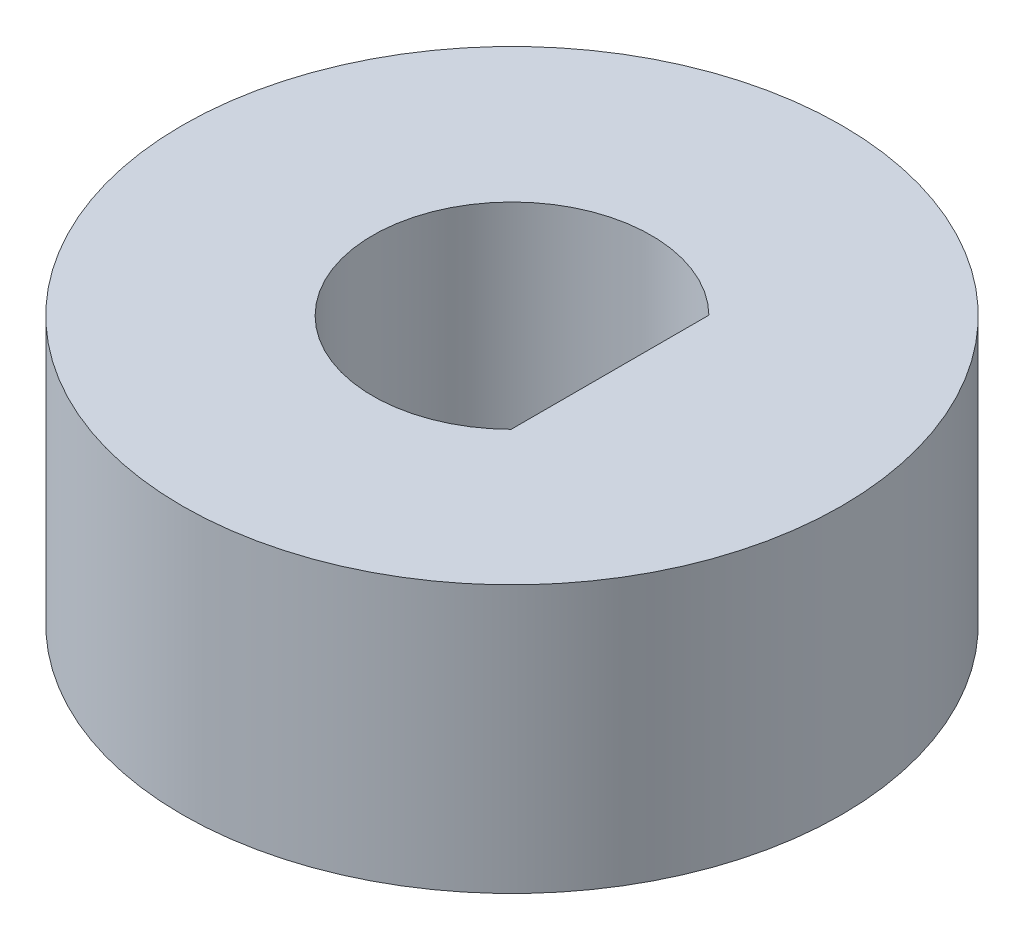
ISO-10303-21;
HEADER;
FILE_DESCRIPTION(('STEP AP214'),'2;1');
FILE_NAME('part.step','',(''),(''),'','','');
FILE_SCHEMA(('AUTOMOTIVE_DESIGN { 1 0 10303 214 1 1 1 1 }'));
ENDSEC;
DATA;
#1=APPLICATION_CONTEXT('core data for automotive mechanical design processes');
#2=APPLICATION_PROTOCOL_DEFINITION('international standard','automotive_design',2000,#1);
#3=PRODUCT_CONTEXT('',#1,'mechanical');
#4=PRODUCT('Part','Part','',(#3));
#5=PRODUCT_RELATED_PRODUCT_CATEGORY('part','',(#4));
#6=PRODUCT_DEFINITION_FORMATION('','',#4);
#7=PRODUCT_DEFINITION_CONTEXT('part definition',#1,'design');
#8=PRODUCT_DEFINITION('design','',#6,#7);
#9=PRODUCT_DEFINITION_SHAPE('','',#8);
#10=(LENGTH_UNIT() NAMED_UNIT(*) SI_UNIT(.MILLI.,.METRE.));
#11=(NAMED_UNIT(*) PLANE_ANGLE_UNIT() SI_UNIT($,.RADIAN.));
#12=(NAMED_UNIT(*) SI_UNIT($,.STERADIAN.) SOLID_ANGLE_UNIT());
#13=UNCERTAINTY_MEASURE_WITH_UNIT(LENGTH_MEASURE(1.E-05),#10,'distance_accuracy_value','');
#14=(GEOMETRIC_REPRESENTATION_CONTEXT(3) GLOBAL_UNCERTAINTY_ASSIGNED_CONTEXT((#13)) GLOBAL_UNIT_ASSIGNED_CONTEXT((#10,
#11,#12)) REPRESENTATION_CONTEXT('',''));
#15=CARTESIAN_POINT('',(0.,0.,0.));
#16=DIRECTION('',(0.,0.,1.));
#17=DIRECTION('',(1.,0.,0.));
#18=AXIS2_PLACEMENT_3D('',#15,#16,#17);
#19=CARTESIAN_POINT('',(0.,6.,0.));
#20=DIRECTION('',(0.,1.,0.));
#21=DIRECTION('',(0.,0.,1.));
#22=AXIS2_PLACEMENT_3D('',#19,#20,#21);
#23=PLANE('',#22);
#24=CARTESIAN_POINT('',(0.,6.,0.));
#25=DIRECTION('',(0.,1.,0.));
#26=DIRECTION('',(0.,0.,1.));
#27=AXIS2_PLACEMENT_3D('',#24,#25,#26);
#28=CIRCLE('',#27,7.4);
#29=CARTESIAN_POINT('',(0.,6.,7.4));
#30=VERTEX_POINT('',#29);
#31=EDGE_CURVE('E11',#30,#30,#28,.T.);
#32=ORIENTED_EDGE('',*,*,#31,.T.);
#33=EDGE_LOOP('',(#32));
#34=FACE_BOUND('',#33,.T.);
#35=DIRECTION('',(0.,0.,-1.));
#36=VECTOR('',#35,1.);
#37=CARTESIAN_POINT('',(2.2,6.,-2.21937491199662));
#38=LINE('',#37,#36);
#39=CARTESIAN_POINT('',(2.2,6.,2.21937491199662));
#40=VERTEX_POINT('',#39);
#41=CARTESIAN_POINT('',(2.2,6.,-2.21937491199662));
#42=VERTEX_POINT('',#41);
#43=EDGE_CURVE('E82',#40,#42,#38,.T.);
#44=ORIENTED_EDGE('',*,*,#43,.F.);
#45=CARTESIAN_POINT('',(0.,6.,0.));
#46=DIRECTION('',(0.,1.,0.));
#47=DIRECTION('',(0.,0.,1.));
#48=AXIS2_PLACEMENT_3D('',#45,#46,#47);
#49=CIRCLE('',#48,3.125);
#50=EDGE_CURVE('E73',#42,#40,#49,.T.);
#51=ORIENTED_EDGE('',*,*,#50,.F.);
#52=EDGE_LOOP('',(#44,#51));
#53=FACE_BOUND('',#52,.T.);
#54=ADVANCED_FACE('F41',(#34,#53),#23,.T.);
#55=CARTESIAN_POINT('',(0.,0.,0.));
#56=DIRECTION('',(0.,1.,0.));
#57=DIRECTION('',(0.,0.,1.));
#58=AXIS2_PLACEMENT_3D('',#55,#56,#57);
#59=PLANE('',#58);
#60=CARTESIAN_POINT('',(0.,0.,0.));
#61=DIRECTION('',(0.,1.,0.));
#62=DIRECTION('',(0.,0.,1.));
#63=AXIS2_PLACEMENT_3D('',#60,#61,#62);
#64=CIRCLE('',#63,7.4);
#65=CARTESIAN_POINT('',(0.,0.,7.4));
#66=VERTEX_POINT('',#65);
#67=EDGE_CURVE('E45',#66,#66,#64,.T.);
#68=ORIENTED_EDGE('',*,*,#67,.F.);
#69=EDGE_LOOP('',(#68));
#70=FACE_BOUND('',#69,.T.);
#71=CARTESIAN_POINT('',(0.,0.,0.));
#72=DIRECTION('',(0.,1.,0.));
#73=DIRECTION('',(0.,0.,1.));
#74=AXIS2_PLACEMENT_3D('',#71,#72,#73);
#75=CIRCLE('',#74,3.125);
#76=CARTESIAN_POINT('',(2.2,0.,-2.21937491199662));
#77=VERTEX_POINT('',#76);
#78=CARTESIAN_POINT('',(2.2,0.,2.21937491199662));
#79=VERTEX_POINT('',#78);
#80=EDGE_CURVE('E63',#77,#79,#75,.T.);
#81=ORIENTED_EDGE('',*,*,#80,.T.);
#82=DIRECTION('',(0.,0.,-1.));
#83=VECTOR('',#82,1.);
#84=CARTESIAN_POINT('',(2.2,0.,-2.21937491199662));
#85=LINE('',#84,#83);
#86=EDGE_CURVE('E69',#79,#77,#85,.T.);
#87=ORIENTED_EDGE('',*,*,#86,.T.);
#88=EDGE_LOOP('',(#81,#87));
#89=FACE_BOUND('',#88,.T.);
#90=ADVANCED_FACE('F79',(#70,#89),#59,.F.);
#91=CARTESIAN_POINT('',(0.,6.,0.));
#92=DIRECTION('',(0.,-1.,0.));
#93=DIRECTION('',(0.,0.,-1.));
#94=AXIS2_PLACEMENT_3D('',#91,#92,#93);
#95=CYLINDRICAL_SURFACE('',#94,7.4);
#96=ORIENTED_EDGE('',*,*,#31,.F.);
#97=EDGE_LOOP('',(#96));
#98=FACE_BOUND('',#97,.T.);
#99=ORIENTED_EDGE('',*,*,#67,.T.);
#100=EDGE_LOOP('',(#99));
#101=FACE_BOUND('',#100,.T.);
#102=ADVANCED_FACE('F43',(#98,#101),#95,.T.);
#103=CARTESIAN_POINT('',(0.,6.,0.));
#104=DIRECTION('',(0.,-1.,0.));
#105=DIRECTION('',(0.,0.,-1.));
#106=AXIS2_PLACEMENT_3D('',#103,#104,#105);
#107=CYLINDRICAL_SURFACE('',#106,3.125);
#108=ORIENTED_EDGE('',*,*,#80,.F.);
#109=DIRECTION('',(0.,-1.,0.));
#110=VECTOR('',#109,1.);
#111=CARTESIAN_POINT('',(2.2,6.,-2.21937491199662));
#112=LINE('',#111,#110);
#113=EDGE_CURVE('E71',#42,#77,#112,.T.);
#114=ORIENTED_EDGE('',*,*,#113,.F.);
#115=ORIENTED_EDGE('',*,*,#50,.T.);
#116=DIRECTION('',(0.,-1.,0.));
#117=VECTOR('',#116,1.);
#118=CARTESIAN_POINT('',(2.2,6.,2.21937491199662));
#119=LINE('',#118,#117);
#120=EDGE_CURVE('E56',#40,#79,#119,.T.);
#121=ORIENTED_EDGE('',*,*,#120,.T.);
#122=EDGE_LOOP('',(#108,#114,#115,#121));
#123=FACE_BOUND('',#122,.T.);
#124=ADVANCED_FACE('F75',(#123),#107,.F.);
#125=CARTESIAN_POINT('',(2.2,6.,-2.21937491199662));
#126=DIRECTION('',(-1.,0.,0.));
#127=DIRECTION('',(0.,0.,1.));
#128=AXIS2_PLACEMENT_3D('',#125,#126,#127);
#129=PLANE('',#128);
#130=ORIENTED_EDGE('',*,*,#86,.F.);
#131=ORIENTED_EDGE('',*,*,#120,.F.);
#132=ORIENTED_EDGE('',*,*,#43,.T.);
#133=ORIENTED_EDGE('',*,*,#113,.T.);
#134=EDGE_LOOP('',(#130,#131,#132,#133));
#135=FACE_BOUND('',#134,.T.);
#136=ADVANCED_FACE('F70',(#135),#129,.T.);
#137=CLOSED_SHELL('',(#54,#90,#102,#124,#136));
#138=MANIFOLD_SOLID_BREP('B2',#137);
#139=ADVANCED_BREP_SHAPE_REPRESENTATION('',(#18,#138),#14);
#140=SHAPE_DEFINITION_REPRESENTATION(#9,#139);
ENDSEC;
END-ISO-10303-21;
